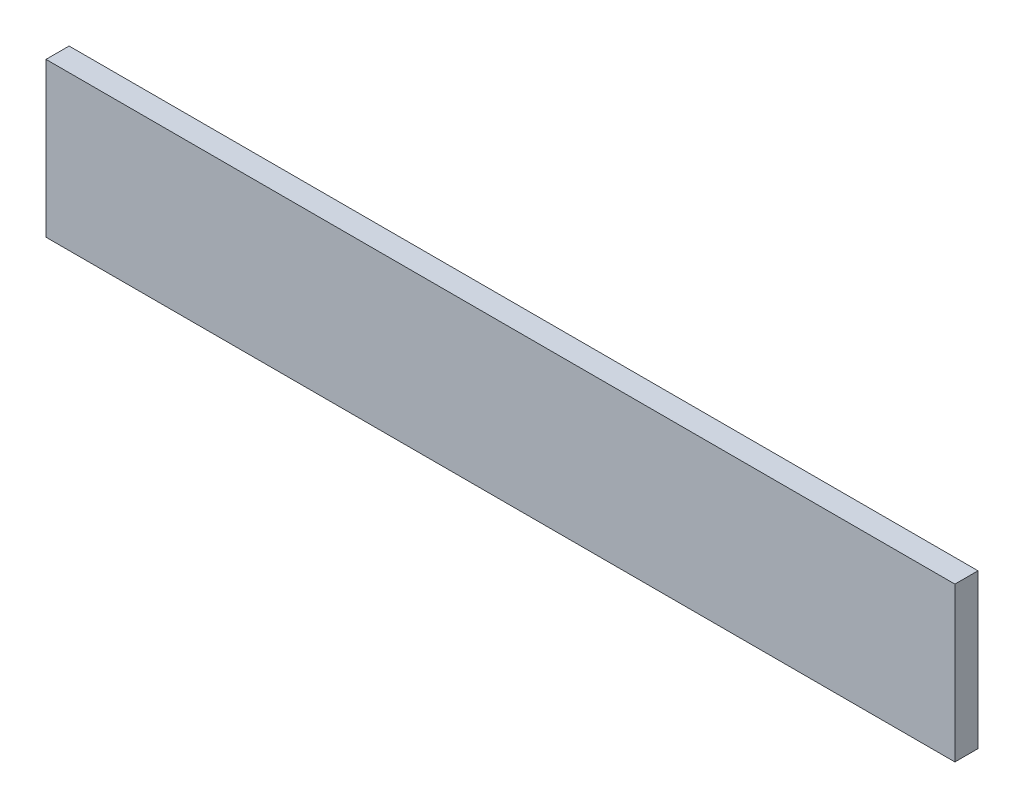
ISO-10303-21;
HEADER;
FILE_DESCRIPTION(('STEP AP214'),'2;1');
FILE_NAME('part.step','',(''),(''),'','','');
FILE_SCHEMA(('AUTOMOTIVE_DESIGN { 1 0 10303 214 1 1 1 1 }'));
ENDSEC;
DATA;
#1=APPLICATION_CONTEXT('core data for automotive mechanical design processes');
#2=APPLICATION_PROTOCOL_DEFINITION('international standard','automotive_design',2000,#1);
#3=PRODUCT_CONTEXT('',#1,'mechanical');
#4=PRODUCT('Part','Part','',(#3));
#5=PRODUCT_RELATED_PRODUCT_CATEGORY('part','',(#4));
#6=PRODUCT_DEFINITION_FORMATION('','',#4);
#7=PRODUCT_DEFINITION_CONTEXT('part definition',#1,'design');
#8=PRODUCT_DEFINITION('design','',#6,#7);
#9=PRODUCT_DEFINITION_SHAPE('','',#8);
#10=(LENGTH_UNIT() NAMED_UNIT(*) SI_UNIT(.MILLI.,.METRE.));
#11=(NAMED_UNIT(*) PLANE_ANGLE_UNIT() SI_UNIT($,.RADIAN.));
#12=(NAMED_UNIT(*) SI_UNIT($,.STERADIAN.) SOLID_ANGLE_UNIT());
#13=UNCERTAINTY_MEASURE_WITH_UNIT(LENGTH_MEASURE(1.E-05),#10,'distance_accuracy_value','');
#14=(GEOMETRIC_REPRESENTATION_CONTEXT(3) GLOBAL_UNCERTAINTY_ASSIGNED_CONTEXT((#13)) GLOBAL_UNIT_ASSIGNED_CONTEXT((#10,
#11,#12)) REPRESENTATION_CONTEXT('',''));
#15=CARTESIAN_POINT('',(0.,0.,0.));
#16=DIRECTION('',(0.,0.,1.));
#17=DIRECTION('',(1.,0.,0.));
#18=AXIS2_PLACEMENT_3D('',#15,#16,#17);
#19=CARTESIAN_POINT('',(749.3,36.8753571428571,7.89214285714286));
#20=DIRECTION('',(0.,0.,-1.));
#21=DIRECTION('',(0.,1.,0.));
#22=AXIS2_PLACEMENT_3D('',#19,#20,#21);
#23=PLANE('',#22);
#24=DIRECTION('',(0.,-1.,0.));
#25=VECTOR('',#24,1.);
#26=CARTESIAN_POINT('',(0.,36.8753571428571,7.89214285714286));
#27=LINE('',#26,#25);
#28=CARTESIAN_POINT('',(0.,36.8753571428571,7.89214285714286));
#29=VERTEX_POINT('',#28);
#30=CARTESIAN_POINT('',(0.,-90.1246428571429,7.89214285714285));
#31=VERTEX_POINT('',#30);
#32=EDGE_CURVE('E95',#29,#31,#27,.T.);
#33=ORIENTED_EDGE('',*,*,#32,.T.);
#34=DIRECTION('',(-1.,0.,0.));
#35=VECTOR('',#34,1.);
#36=CARTESIAN_POINT('',(749.3,-90.1246428571429,7.89214285714285));
#37=LINE('',#36,#35);
#38=CARTESIAN_POINT('',(749.3,-90.1246428571429,7.89214285714285));
#39=VERTEX_POINT('',#38);
#40=EDGE_CURVE('E11',#39,#31,#37,.T.);
#41=ORIENTED_EDGE('',*,*,#40,.F.);
#42=DIRECTION('',(0.,-1.,0.));
#43=VECTOR('',#42,1.);
#44=CARTESIAN_POINT('',(749.3,36.8753571428571,7.89214285714286));
#45=LINE('',#44,#43);
#46=CARTESIAN_POINT('',(749.3,36.8753571428571,7.89214285714286));
#47=VERTEX_POINT('',#46);
#48=EDGE_CURVE('E83',#47,#39,#45,.T.);
#49=ORIENTED_EDGE('',*,*,#48,.F.);
#50=DIRECTION('',(-1.,0.,0.));
#51=VECTOR('',#50,1.);
#52=CARTESIAN_POINT('',(749.3,36.8753571428571,7.89214285714286));
#53=LINE('',#52,#51);
#54=EDGE_CURVE('E91',#47,#29,#53,.T.);
#55=ORIENTED_EDGE('',*,*,#54,.T.);
#56=EDGE_LOOP('',(#33,#41,#49,#55));
#57=FACE_BOUND('',#56,.T.);
#58=ADVANCED_FACE('F32',(#57),#23,.F.);
#59=CARTESIAN_POINT('',(749.3,-90.1246428571429,7.89214285714285));
#60=DIRECTION('',(0.,1.,0.));
#61=DIRECTION('',(0.,0.,1.));
#62=AXIS2_PLACEMENT_3D('',#59,#60,#61);
#63=PLANE('',#62);
#64=DIRECTION('',(0.,0.,-1.));
#65=VECTOR('',#64,1.);
#66=CARTESIAN_POINT('',(0.,-90.1246428571429,7.89214285714285));
#67=LINE('',#66,#65);
#68=CARTESIAN_POINT('',(0.,-90.1246428571429,-11.1578571428572));
#69=VERTEX_POINT('',#68);
#70=EDGE_CURVE('E87',#31,#69,#67,.T.);
#71=ORIENTED_EDGE('',*,*,#70,.T.);
#72=DIRECTION('',(-1.,0.,0.));
#73=VECTOR('',#72,1.);
#74=CARTESIAN_POINT('',(749.3,-90.1246428571429,-11.1578571428572));
#75=LINE('',#74,#73);
#76=CARTESIAN_POINT('',(749.3,-90.1246428571429,-11.1578571428572));
#77=VERTEX_POINT('',#76);
#78=EDGE_CURVE('E40',#77,#69,#75,.T.);
#79=ORIENTED_EDGE('',*,*,#78,.F.);
#80=DIRECTION('',(0.,0.,-1.));
#81=VECTOR('',#80,1.);
#82=CARTESIAN_POINT('',(749.3,-90.1246428571429,7.89214285714285));
#83=LINE('',#82,#81);
#84=EDGE_CURVE('E78',#39,#77,#83,.T.);
#85=ORIENTED_EDGE('',*,*,#84,.F.);
#86=ORIENTED_EDGE('',*,*,#40,.T.);
#87=EDGE_LOOP('',(#71,#79,#85,#86));
#88=FACE_BOUND('',#87,.T.);
#89=ADVANCED_FACE('F86',(#88),#63,.F.);
#90=CARTESIAN_POINT('',(749.3,36.8753571428571,-11.1578571428571));
#91=DIRECTION('',(0.,0.,1.));
#92=DIRECTION('',(0.,-1.,0.));
#93=AXIS2_PLACEMENT_3D('',#90,#91,#92);
#94=PLANE('',#93);
#95=DIRECTION('',(0.,1.,0.));
#96=VECTOR('',#95,1.);
#97=CARTESIAN_POINT('',(0.,36.8753571428571,-11.1578571428571));
#98=LINE('',#97,#96);
#99=CARTESIAN_POINT('',(0.,36.8753571428571,-11.1578571428571));
#100=VERTEX_POINT('',#99);
#101=EDGE_CURVE('E65',#69,#100,#98,.T.);
#102=ORIENTED_EDGE('',*,*,#101,.T.);
#103=DIRECTION('',(-1.,0.,0.));
#104=VECTOR('',#103,1.);
#105=CARTESIAN_POINT('',(749.3,36.8753571428571,-11.1578571428571));
#106=LINE('',#105,#104);
#107=CARTESIAN_POINT('',(749.3,36.8753571428571,-11.1578571428571));
#108=VERTEX_POINT('',#107);
#109=EDGE_CURVE('E88',#108,#100,#106,.T.);
#110=ORIENTED_EDGE('',*,*,#109,.F.);
#111=DIRECTION('',(0.,1.,0.));
#112=VECTOR('',#111,1.);
#113=CARTESIAN_POINT('',(749.3,36.8753571428571,-11.1578571428571));
#114=LINE('',#113,#112);
#115=EDGE_CURVE('E81',#77,#108,#114,.T.);
#116=ORIENTED_EDGE('',*,*,#115,.F.);
#117=ORIENTED_EDGE('',*,*,#78,.T.);
#118=EDGE_LOOP('',(#102,#110,#116,#117));
#119=FACE_BOUND('',#118,.T.);
#120=ADVANCED_FACE('F89',(#119),#94,.F.);
#121=CARTESIAN_POINT('',(749.3,36.8753571428571,7.89214285714286));
#122=DIRECTION('',(0.,-1.,0.));
#123=DIRECTION('',(0.,0.,-1.));
#124=AXIS2_PLACEMENT_3D('',#121,#122,#123);
#125=PLANE('',#124);
#126=DIRECTION('',(0.,0.,1.));
#127=VECTOR('',#126,1.);
#128=CARTESIAN_POINT('',(0.,36.8753571428571,7.89214285714286));
#129=LINE('',#128,#127);
#130=EDGE_CURVE('E71',#100,#29,#129,.T.);
#131=ORIENTED_EDGE('',*,*,#130,.T.);
#132=ORIENTED_EDGE('',*,*,#54,.F.);
#133=DIRECTION('',(0.,0.,1.));
#134=VECTOR('',#133,1.);
#135=CARTESIAN_POINT('',(749.3,36.8753571428571,7.89214285714286));
#136=LINE('',#135,#134);
#137=EDGE_CURVE('E48',#108,#47,#136,.T.);
#138=ORIENTED_EDGE('',*,*,#137,.F.);
#139=ORIENTED_EDGE('',*,*,#109,.T.);
#140=EDGE_LOOP('',(#131,#132,#138,#139));
#141=FACE_BOUND('',#140,.T.);
#142=ADVANCED_FACE('F102',(#141),#125,.F.);
#143=CARTESIAN_POINT('',(749.3,0.,0.));
#144=DIRECTION('',(1.,0.,0.));
#145=DIRECTION('',(0.,0.,-1.));
#146=AXIS2_PLACEMENT_3D('',#143,#144,#145);
#147=PLANE('',#146);
#148=ORIENTED_EDGE('',*,*,#48,.T.);
#149=ORIENTED_EDGE('',*,*,#84,.T.);
#150=ORIENTED_EDGE('',*,*,#115,.T.);
#151=ORIENTED_EDGE('',*,*,#137,.T.);
#152=EDGE_LOOP('',(#148,#149,#150,#151));
#153=FACE_BOUND('',#152,.T.);
#154=ADVANCED_FACE('F79',(#153),#147,.T.);
#155=CARTESIAN_POINT('',(0.,0.,0.));
#156=DIRECTION('',(1.,0.,0.));
#157=DIRECTION('',(0.,0.,-1.));
#158=AXIS2_PLACEMENT_3D('',#155,#156,#157);
#159=PLANE('',#158);
#160=ORIENTED_EDGE('',*,*,#32,.F.);
#161=ORIENTED_EDGE('',*,*,#130,.F.);
#162=ORIENTED_EDGE('',*,*,#101,.F.);
#163=ORIENTED_EDGE('',*,*,#70,.F.);
#164=EDGE_LOOP('',(#160,#161,#162,#163));
#165=FACE_BOUND('',#164,.T.);
#166=ADVANCED_FACE('F105',(#165),#159,.F.);
#167=CLOSED_SHELL('',(#58,#89,#120,#142,#154,#166));
#168=MANIFOLD_SOLID_BREP('B2',#167);
#169=ADVANCED_BREP_SHAPE_REPRESENTATION('',(#18,#168),#14);
#170=SHAPE_DEFINITION_REPRESENTATION(#9,#169);
ENDSEC;
END-ISO-10303-21;
